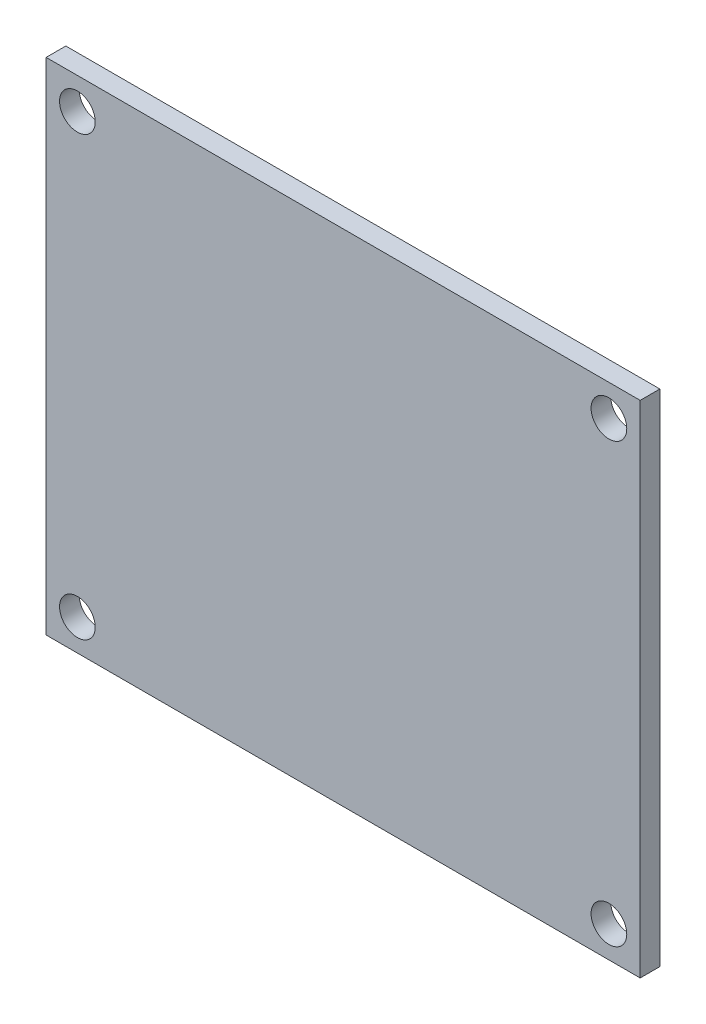
ISO-10303-21;
HEADER;
FILE_DESCRIPTION(('STEP AP214'),'2;1');
FILE_NAME('part.step','',(''),(''),'','','');
FILE_SCHEMA(('AUTOMOTIVE_DESIGN { 1 0 10303 214 1 1 1 1 }'));
ENDSEC;
DATA;
#1=APPLICATION_CONTEXT('core data for automotive mechanical design processes');
#2=APPLICATION_PROTOCOL_DEFINITION('international standard','automotive_design',2000,#1);
#3=PRODUCT_CONTEXT('',#1,'mechanical');
#4=PRODUCT('Part','Part','',(#3));
#5=PRODUCT_RELATED_PRODUCT_CATEGORY('part','',(#4));
#6=PRODUCT_DEFINITION_FORMATION('','',#4);
#7=PRODUCT_DEFINITION_CONTEXT('part definition',#1,'design');
#8=PRODUCT_DEFINITION('design','',#6,#7);
#9=PRODUCT_DEFINITION_SHAPE('','',#8);
#10=(LENGTH_UNIT() NAMED_UNIT(*) SI_UNIT(.MILLI.,.METRE.));
#11=(NAMED_UNIT(*) PLANE_ANGLE_UNIT() SI_UNIT($,.RADIAN.));
#12=(NAMED_UNIT(*) SI_UNIT($,.STERADIAN.) SOLID_ANGLE_UNIT());
#13=UNCERTAINTY_MEASURE_WITH_UNIT(LENGTH_MEASURE(1.E-05),#10,'distance_accuracy_value','');
#14=(GEOMETRIC_REPRESENTATION_CONTEXT(3) GLOBAL_UNCERTAINTY_ASSIGNED_CONTEXT((#13)) GLOBAL_UNIT_ASSIGNED_CONTEXT((#10,
#11,#12)) REPRESENTATION_CONTEXT('',''));
#15=CARTESIAN_POINT('',(0.,0.,0.));
#16=DIRECTION('',(0.,0.,1.));
#17=DIRECTION('',(1.,0.,0.));
#18=AXIS2_PLACEMENT_3D('',#15,#16,#17);
#19=CARTESIAN_POINT('',(0.,0.,1.6));
#20=DIRECTION('',(0.,0.,1.));
#21=DIRECTION('',(1.,0.,0.));
#22=AXIS2_PLACEMENT_3D('',#19,#20,#21);
#23=PLANE('',#22);
#24=CARTESIAN_POINT('',(21.59,-17.78,1.6));
#25=DIRECTION('',(0.,0.,1.));
#26=DIRECTION('',(1.,0.,0.));
#27=AXIS2_PLACEMENT_3D('',#24,#25,#26);
#28=CIRCLE('',#27,1.45);
#29=CARTESIAN_POINT('',(23.04,-17.78,1.6));
#30=VERTEX_POINT('',#29);
#31=EDGE_CURVE('E148',#30,#30,#28,.T.);
#32=ORIENTED_EDGE('',*,*,#31,.F.);
#33=EDGE_LOOP('',(#32));
#34=FACE_BOUND('',#33,.T.);
#35=CARTESIAN_POINT('',(-21.59,17.78,1.6));
#36=DIRECTION('',(0.,0.,1.));
#37=DIRECTION('',(1.,0.,0.));
#38=AXIS2_PLACEMENT_3D('',#35,#36,#37);
#39=CIRCLE('',#38,1.45);
#40=CARTESIAN_POINT('',(-20.14,17.78,1.6));
#41=VERTEX_POINT('',#40);
#42=EDGE_CURVE('E118',#41,#41,#39,.T.);
#43=ORIENTED_EDGE('',*,*,#42,.F.);
#44=EDGE_LOOP('',(#43));
#45=FACE_BOUND('',#44,.T.);
#46=DIRECTION('',(0.,1.,0.));
#47=VECTOR('',#46,1.);
#48=CARTESIAN_POINT('',(24.13,20.32,1.6));
#49=LINE('',#48,#47);
#50=CARTESIAN_POINT('',(24.13,-20.32,1.6));
#51=VERTEX_POINT('',#50);
#52=CARTESIAN_POINT('',(24.13,20.32,1.6));
#53=VERTEX_POINT('',#52);
#54=EDGE_CURVE('E98',#51,#53,#49,.T.);
#55=ORIENTED_EDGE('',*,*,#54,.T.);
#56=DIRECTION('',(-1.,0.,0.));
#57=VECTOR('',#56,1.);
#58=CARTESIAN_POINT('',(-24.13,20.32,1.6));
#59=LINE('',#58,#57);
#60=CARTESIAN_POINT('',(-24.13,20.32,1.6));
#61=VERTEX_POINT('',#60);
#62=EDGE_CURVE('E93',#53,#61,#59,.T.);
#63=ORIENTED_EDGE('',*,*,#62,.T.);
#64=DIRECTION('',(0.,-1.,0.));
#65=VECTOR('',#64,1.);
#66=CARTESIAN_POINT('',(-24.13,20.32,1.6));
#67=LINE('',#66,#65);
#68=CARTESIAN_POINT('',(-24.13,-20.32,1.6));
#69=VERTEX_POINT('',#68);
#70=EDGE_CURVE('E96',#61,#69,#67,.T.);
#71=ORIENTED_EDGE('',*,*,#70,.T.);
#72=DIRECTION('',(1.,0.,0.));
#73=VECTOR('',#72,1.);
#74=CARTESIAN_POINT('',(-24.13,-20.32,1.6));
#75=LINE('',#74,#73);
#76=EDGE_CURVE('E63',#69,#51,#75,.T.);
#77=ORIENTED_EDGE('',*,*,#76,.T.);
#78=EDGE_LOOP('',(#55,#63,#71,#77));
#79=FACE_BOUND('',#78,.T.);
#80=CARTESIAN_POINT('',(21.59,17.78,1.6));
#81=DIRECTION('',(0.,0.,1.));
#82=DIRECTION('',(1.,0.,0.));
#83=AXIS2_PLACEMENT_3D('',#80,#81,#82);
#84=CIRCLE('',#83,1.45);
#85=CARTESIAN_POINT('',(23.04,17.78,1.6));
#86=VERTEX_POINT('',#85);
#87=EDGE_CURVE('E140',#86,#86,#84,.T.);
#88=ORIENTED_EDGE('',*,*,#87,.F.);
#89=EDGE_LOOP('',(#88));
#90=FACE_BOUND('',#89,.T.);
#91=CARTESIAN_POINT('',(-21.59,-17.78,1.6));
#92=DIRECTION('',(0.,0.,1.));
#93=DIRECTION('',(1.,0.,0.));
#94=AXIS2_PLACEMENT_3D('',#91,#92,#93);
#95=CIRCLE('',#94,1.45);
#96=CARTESIAN_POINT('',(-20.14,-17.78,1.6));
#97=VERTEX_POINT('',#96);
#98=EDGE_CURVE('E156',#97,#97,#95,.T.);
#99=ORIENTED_EDGE('',*,*,#98,.F.);
#100=EDGE_LOOP('',(#99));
#101=FACE_BOUND('',#100,.T.);
#102=ADVANCED_FACE('F45',(#34,#45,#79,#90,#101),#23,.T.);
#103=CARTESIAN_POINT('',(0.,0.,0.));
#104=DIRECTION('',(0.,0.,1.));
#105=DIRECTION('',(1.,0.,0.));
#106=AXIS2_PLACEMENT_3D('',#103,#104,#105);
#107=PLANE('',#106);
#108=DIRECTION('',(0.,1.,0.));
#109=VECTOR('',#108,1.);
#110=CARTESIAN_POINT('',(24.13,20.32,0.));
#111=LINE('',#110,#109);
#112=CARTESIAN_POINT('',(24.13,-20.32,0.));
#113=VERTEX_POINT('',#112);
#114=CARTESIAN_POINT('',(24.13,20.32,0.));
#115=VERTEX_POINT('',#114);
#116=EDGE_CURVE('E114',#113,#115,#111,.T.);
#117=ORIENTED_EDGE('',*,*,#116,.F.);
#118=DIRECTION('',(1.,0.,0.));
#119=VECTOR('',#118,1.);
#120=CARTESIAN_POINT('',(-24.13,-20.32,0.));
#121=LINE('',#120,#119);
#122=CARTESIAN_POINT('',(-24.13,-20.32,0.));
#123=VERTEX_POINT('',#122);
#124=EDGE_CURVE('E86',#123,#113,#121,.T.);
#125=ORIENTED_EDGE('',*,*,#124,.F.);
#126=DIRECTION('',(0.,-1.,0.));
#127=VECTOR('',#126,1.);
#128=CARTESIAN_POINT('',(-24.13,20.32,0.));
#129=LINE('',#128,#127);
#130=CARTESIAN_POINT('',(-24.13,20.32,0.));
#131=VERTEX_POINT('',#130);
#132=EDGE_CURVE('E80',#131,#123,#129,.T.);
#133=ORIENTED_EDGE('',*,*,#132,.F.);
#134=DIRECTION('',(-1.,0.,0.));
#135=VECTOR('',#134,1.);
#136=CARTESIAN_POINT('',(-24.13,20.32,0.));
#137=LINE('',#136,#135);
#138=EDGE_CURVE('E103',#115,#131,#137,.T.);
#139=ORIENTED_EDGE('',*,*,#138,.F.);
#140=EDGE_LOOP('',(#117,#125,#133,#139));
#141=FACE_BOUND('',#140,.T.);
#142=CARTESIAN_POINT('',(-21.59,17.78,0.));
#143=DIRECTION('',(0.,0.,1.));
#144=DIRECTION('',(1.,0.,0.));
#145=AXIS2_PLACEMENT_3D('',#142,#143,#144);
#146=CIRCLE('',#145,1.45);
#147=CARTESIAN_POINT('',(-20.14,17.78,0.));
#148=VERTEX_POINT('',#147);
#149=EDGE_CURVE('E136',#148,#148,#146,.T.);
#150=ORIENTED_EDGE('',*,*,#149,.T.);
#151=EDGE_LOOP('',(#150));
#152=FACE_BOUND('',#151,.T.);
#153=CARTESIAN_POINT('',(21.59,17.78,0.));
#154=DIRECTION('',(0.,0.,1.));
#155=DIRECTION('',(1.,0.,0.));
#156=AXIS2_PLACEMENT_3D('',#153,#154,#155);
#157=CIRCLE('',#156,1.45);
#158=CARTESIAN_POINT('',(23.04,17.78,0.));
#159=VERTEX_POINT('',#158);
#160=EDGE_CURVE('E144',#159,#159,#157,.T.);
#161=ORIENTED_EDGE('',*,*,#160,.T.);
#162=EDGE_LOOP('',(#161));
#163=FACE_BOUND('',#162,.T.);
#164=CARTESIAN_POINT('',(21.59,-17.78,0.));
#165=DIRECTION('',(0.,0.,1.));
#166=DIRECTION('',(1.,0.,0.));
#167=AXIS2_PLACEMENT_3D('',#164,#165,#166);
#168=CIRCLE('',#167,1.45);
#169=CARTESIAN_POINT('',(23.04,-17.78,0.));
#170=VERTEX_POINT('',#169);
#171=EDGE_CURVE('E152',#170,#170,#168,.T.);
#172=ORIENTED_EDGE('',*,*,#171,.T.);
#173=EDGE_LOOP('',(#172));
#174=FACE_BOUND('',#173,.T.);
#175=CARTESIAN_POINT('',(-21.59,-17.78,0.));
#176=DIRECTION('',(0.,0.,1.));
#177=DIRECTION('',(1.,0.,0.));
#178=AXIS2_PLACEMENT_3D('',#175,#176,#177);
#179=CIRCLE('',#178,1.45);
#180=CARTESIAN_POINT('',(-20.14,-17.78,0.));
#181=VERTEX_POINT('',#180);
#182=EDGE_CURVE('E160',#181,#181,#179,.T.);
#183=ORIENTED_EDGE('',*,*,#182,.T.);
#184=EDGE_LOOP('',(#183));
#185=FACE_BOUND('',#184,.T.);
#186=ADVANCED_FACE('F131',(#141,#152,#163,#174,#185),#107,.F.);
#187=CARTESIAN_POINT('',(24.13,20.32,1.6));
#188=DIRECTION('',(-1.,0.,0.));
#189=DIRECTION('',(0.,-1.,0.));
#190=AXIS2_PLACEMENT_3D('',#187,#188,#189);
#191=PLANE('',#190);
#192=ORIENTED_EDGE('',*,*,#116,.T.);
#193=DIRECTION('',(0.,0.,-1.));
#194=VECTOR('',#193,1.);
#195=CARTESIAN_POINT('',(24.13,20.32,1.6));
#196=LINE('',#195,#194);
#197=EDGE_CURVE('E11',#53,#115,#196,.T.);
#198=ORIENTED_EDGE('',*,*,#197,.F.);
#199=ORIENTED_EDGE('',*,*,#54,.F.);
#200=DIRECTION('',(0.,0.,-1.));
#201=VECTOR('',#200,1.);
#202=CARTESIAN_POINT('',(24.13,-20.32,1.6));
#203=LINE('',#202,#201);
#204=EDGE_CURVE('E110',#51,#113,#203,.T.);
#205=ORIENTED_EDGE('',*,*,#204,.T.);
#206=EDGE_LOOP('',(#192,#198,#199,#205));
#207=FACE_BOUND('',#206,.T.);
#208=ADVANCED_FACE('F47',(#207),#191,.F.);
#209=CARTESIAN_POINT('',(-24.13,20.32,1.6));
#210=DIRECTION('',(0.,-1.,0.));
#211=DIRECTION('',(0.,0.,-1.));
#212=AXIS2_PLACEMENT_3D('',#209,#210,#211);
#213=PLANE('',#212);
#214=ORIENTED_EDGE('',*,*,#138,.T.);
#215=DIRECTION('',(0.,0.,-1.));
#216=VECTOR('',#215,1.);
#217=CARTESIAN_POINT('',(-24.13,20.32,1.6));
#218=LINE('',#217,#216);
#219=EDGE_CURVE('E55',#61,#131,#218,.T.);
#220=ORIENTED_EDGE('',*,*,#219,.F.);
#221=ORIENTED_EDGE('',*,*,#62,.F.);
#222=ORIENTED_EDGE('',*,*,#197,.T.);
#223=EDGE_LOOP('',(#214,#220,#221,#222));
#224=FACE_BOUND('',#223,.T.);
#225=ADVANCED_FACE('F102',(#224),#213,.F.);
#226=CARTESIAN_POINT('',(-24.13,20.32,1.6));
#227=DIRECTION('',(1.,0.,0.));
#228=DIRECTION('',(0.,1.,0.));
#229=AXIS2_PLACEMENT_3D('',#226,#227,#228);
#230=PLANE('',#229);
#231=ORIENTED_EDGE('',*,*,#132,.T.);
#232=DIRECTION('',(0.,0.,-1.));
#233=VECTOR('',#232,1.);
#234=CARTESIAN_POINT('',(-24.13,-20.32,1.6));
#235=LINE('',#234,#233);
#236=EDGE_CURVE('E105',#69,#123,#235,.T.);
#237=ORIENTED_EDGE('',*,*,#236,.F.);
#238=ORIENTED_EDGE('',*,*,#70,.F.);
#239=ORIENTED_EDGE('',*,*,#219,.T.);
#240=EDGE_LOOP('',(#231,#237,#238,#239));
#241=FACE_BOUND('',#240,.T.);
#242=ADVANCED_FACE('F106',(#241),#230,.F.);
#243=CARTESIAN_POINT('',(-24.13,-20.32,1.6));
#244=DIRECTION('',(0.,1.,0.));
#245=DIRECTION('',(0.,0.,1.));
#246=AXIS2_PLACEMENT_3D('',#243,#244,#245);
#247=PLANE('',#246);
#248=ORIENTED_EDGE('',*,*,#124,.T.);
#249=ORIENTED_EDGE('',*,*,#204,.F.);
#250=ORIENTED_EDGE('',*,*,#76,.F.);
#251=ORIENTED_EDGE('',*,*,#236,.T.);
#252=EDGE_LOOP('',(#248,#249,#250,#251));
#253=FACE_BOUND('',#252,.T.);
#254=ADVANCED_FACE('F128',(#253),#247,.F.);
#255=CARTESIAN_POINT('',(-21.59,17.78,1.6));
#256=DIRECTION('',(0.,0.,-1.));
#257=DIRECTION('',(-1.,0.,0.));
#258=AXIS2_PLACEMENT_3D('',#255,#256,#257);
#259=CYLINDRICAL_SURFACE('',#258,1.45);
#260=ORIENTED_EDGE('',*,*,#42,.T.);
#261=EDGE_LOOP('',(#260));
#262=FACE_BOUND('',#261,.T.);
#263=ORIENTED_EDGE('',*,*,#149,.F.);
#264=EDGE_LOOP('',(#263));
#265=FACE_BOUND('',#264,.T.);
#266=ADVANCED_FACE('F181',(#262,#265),#259,.F.);
#267=CARTESIAN_POINT('',(21.59,17.78,1.6));
#268=DIRECTION('',(0.,0.,-1.));
#269=DIRECTION('',(-1.,0.,0.));
#270=AXIS2_PLACEMENT_3D('',#267,#268,#269);
#271=CYLINDRICAL_SURFACE('',#270,1.45);
#272=ORIENTED_EDGE('',*,*,#87,.T.);
#273=EDGE_LOOP('',(#272));
#274=FACE_BOUND('',#273,.T.);
#275=ORIENTED_EDGE('',*,*,#160,.F.);
#276=EDGE_LOOP('',(#275));
#277=FACE_BOUND('',#276,.T.);
#278=ADVANCED_FACE('F226',(#274,#277),#271,.F.);
#279=CARTESIAN_POINT('',(21.59,-17.78,1.6));
#280=DIRECTION('',(0.,0.,-1.));
#281=DIRECTION('',(-1.,0.,0.));
#282=AXIS2_PLACEMENT_3D('',#279,#280,#281);
#283=CYLINDRICAL_SURFACE('',#282,1.45);
#284=ORIENTED_EDGE('',*,*,#31,.T.);
#285=EDGE_LOOP('',(#284));
#286=FACE_BOUND('',#285,.T.);
#287=ORIENTED_EDGE('',*,*,#171,.F.);
#288=EDGE_LOOP('',(#287));
#289=FACE_BOUND('',#288,.T.);
#290=ADVANCED_FACE('F234',(#286,#289),#283,.F.);
#291=CARTESIAN_POINT('',(-21.59,-17.78,1.6));
#292=DIRECTION('',(0.,0.,-1.));
#293=DIRECTION('',(-1.,0.,0.));
#294=AXIS2_PLACEMENT_3D('',#291,#292,#293);
#295=CYLINDRICAL_SURFACE('',#294,1.45);
#296=ORIENTED_EDGE('',*,*,#98,.T.);
#297=EDGE_LOOP('',(#296));
#298=FACE_BOUND('',#297,.T.);
#299=ORIENTED_EDGE('',*,*,#182,.F.);
#300=EDGE_LOOP('',(#299));
#301=FACE_BOUND('',#300,.T.);
#302=ADVANCED_FACE('F168',(#298,#301),#295,.F.);
#303=CLOSED_SHELL('',(#102,#186,#208,#225,#242,#254,#266,#278,#290,#302));
#304=MANIFOLD_SOLID_BREP('B2',#303);
#305=ADVANCED_BREP_SHAPE_REPRESENTATION('',(#18,#304),#14);
#306=SHAPE_DEFINITION_REPRESENTATION(#9,#305);
ENDSEC;
END-ISO-10303-21;
